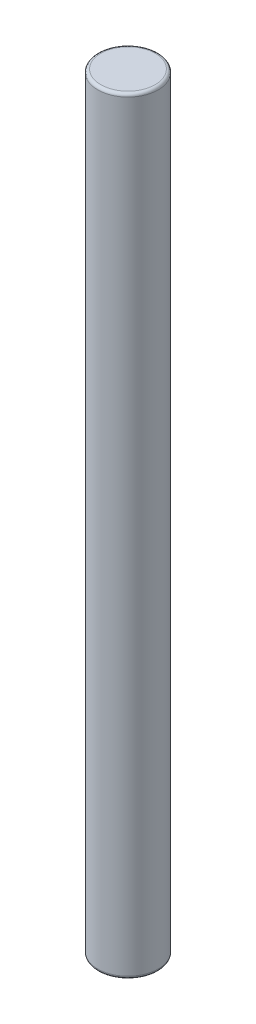
ISO-10303-21;
HEADER;
FILE_DESCRIPTION(('STEP AP214'),'2;1');
FILE_NAME('part.step','',(''),(''),'','','');
FILE_SCHEMA(('AUTOMOTIVE_DESIGN { 1 0 10303 214 1 1 1 1 }'));
ENDSEC;
DATA;
#1=APPLICATION_CONTEXT('core data for automotive mechanical design processes');
#2=APPLICATION_PROTOCOL_DEFINITION('international standard','automotive_design',2000,#1);
#3=PRODUCT_CONTEXT('',#1,'mechanical');
#4=PRODUCT('Part','Part','',(#3));
#5=PRODUCT_RELATED_PRODUCT_CATEGORY('part','',(#4));
#6=PRODUCT_DEFINITION_FORMATION('','',#4);
#7=PRODUCT_DEFINITION_CONTEXT('part definition',#1,'design');
#8=PRODUCT_DEFINITION('design','',#6,#7);
#9=PRODUCT_DEFINITION_SHAPE('','',#8);
#10=(LENGTH_UNIT() NAMED_UNIT(*) SI_UNIT(.MILLI.,.METRE.));
#11=(NAMED_UNIT(*) PLANE_ANGLE_UNIT() SI_UNIT($,.RADIAN.));
#12=(NAMED_UNIT(*) SI_UNIT($,.STERADIAN.) SOLID_ANGLE_UNIT());
#13=UNCERTAINTY_MEASURE_WITH_UNIT(LENGTH_MEASURE(1.E-05),#10,'distance_accuracy_value','');
#14=(GEOMETRIC_REPRESENTATION_CONTEXT(3) GLOBAL_UNCERTAINTY_ASSIGNED_CONTEXT((#13)) GLOBAL_UNIT_ASSIGNED_CONTEXT((#10,
#11,#12)) REPRESENTATION_CONTEXT('',''));
#15=CARTESIAN_POINT('',(0.,0.,0.));
#16=DIRECTION('',(0.,0.,1.));
#17=DIRECTION('',(1.,0.,0.));
#18=AXIS2_PLACEMENT_3D('',#15,#16,#17);
#19=CARTESIAN_POINT('',(0.,127.,0.));
#20=DIRECTION('',(0.,-1.,0.));
#21=DIRECTION('',(0.,0.,-1.));
#22=AXIS2_PLACEMENT_3D('',#19,#20,#21);
#23=CYLINDRICAL_SURFACE('',#22,5.);
#24=CARTESIAN_POINT('',(0.,0.5,0.));
#25=DIRECTION('',(0.,1.,0.));
#26=DIRECTION('',(0.,0.,1.));
#27=AXIS2_PLACEMENT_3D('',#24,#25,#26);
#28=CIRCLE('',#27,5.);
#29=CARTESIAN_POINT('',(0.,0.5,5.));
#30=VERTEX_POINT('',#29);
#31=EDGE_CURVE('E50',#30,#30,#28,.T.);
#32=ORIENTED_EDGE('',*,*,#31,.T.);
#33=EDGE_LOOP('',(#32));
#34=FACE_BOUND('',#33,.T.);
#35=CARTESIAN_POINT('',(0.,126.5,0.));
#36=DIRECTION('',(0.,1.,0.));
#37=DIRECTION('',(0.,0.,1.));
#38=AXIS2_PLACEMENT_3D('',#35,#36,#37);
#39=CIRCLE('',#38,5.);
#40=CARTESIAN_POINT('',(0.,126.5,5.));
#41=VERTEX_POINT('',#40);
#42=EDGE_CURVE('E55',#41,#41,#39,.F.);
#43=ORIENTED_EDGE('',*,*,#42,.T.);
#44=EDGE_LOOP('',(#43));
#45=FACE_BOUND('',#44,.T.);
#46=ADVANCED_FACE('F37',(#34,#45),#23,.T.);
#47=CARTESIAN_POINT('',(0.,127.,0.));
#48=DIRECTION('',(0.,1.,0.));
#49=DIRECTION('',(0.,0.,1.));
#50=AXIS2_PLACEMENT_3D('',#47,#48,#49);
#51=PLANE('',#50);
#52=CARTESIAN_POINT('',(0.,127.,0.));
#53=DIRECTION('',(0.,1.,0.));
#54=DIRECTION('',(0.,0.,1.));
#55=AXIS2_PLACEMENT_3D('',#52,#53,#54);
#56=CIRCLE('',#55,4.5);
#57=CARTESIAN_POINT('',(0.,127.,4.5));
#58=VERTEX_POINT('',#57);
#59=EDGE_CURVE('E10',#58,#58,#56,.T.);
#60=ORIENTED_EDGE('',*,*,#59,.T.);
#61=EDGE_LOOP('',(#60));
#62=FACE_BOUND('',#61,.T.);
#63=ADVANCED_FACE('F72',(#62),#51,.T.);
#64=CARTESIAN_POINT('',(0.,0.,0.));
#65=DIRECTION('',(0.,1.,0.));
#66=DIRECTION('',(0.,0.,1.));
#67=AXIS2_PLACEMENT_3D('',#64,#65,#66);
#68=PLANE('',#67);
#69=CARTESIAN_POINT('',(0.,0.,0.));
#70=DIRECTION('',(0.,1.,0.));
#71=DIRECTION('',(0.,0.,1.));
#72=AXIS2_PLACEMENT_3D('',#69,#70,#71);
#73=CIRCLE('',#72,4.5);
#74=CARTESIAN_POINT('',(0.,0.,4.5));
#75=VERTEX_POINT('',#74);
#76=EDGE_CURVE('E45',#75,#75,#73,.F.);
#77=ORIENTED_EDGE('',*,*,#76,.T.);
#78=EDGE_LOOP('',(#77));
#79=FACE_BOUND('',#78,.T.);
#80=ADVANCED_FACE('F69',(#79),#68,.F.);
#81=CARTESIAN_POINT('',(0.,0.5,0.));
#82=DIRECTION('',(0.,1.,0.));
#83=DIRECTION('',(0.,0.,1.));
#84=AXIS2_PLACEMENT_3D('',#81,#82,#83);
#85=TOROIDAL_SURFACE('',#84,4.5,0.5);
#86=ORIENTED_EDGE('',*,*,#76,.F.);
#87=EDGE_LOOP('',(#86));
#88=FACE_BOUND('',#87,.T.);
#89=ORIENTED_EDGE('',*,*,#31,.F.);
#90=EDGE_LOOP('',(#89));
#91=FACE_BOUND('',#90,.T.);
#92=ADVANCED_FACE('F65',(#88,#91),#85,.T.);
#93=CARTESIAN_POINT('',(0.,126.5,0.));
#94=DIRECTION('',(0.,1.,0.));
#95=DIRECTION('',(0.,0.,1.));
#96=AXIS2_PLACEMENT_3D('',#93,#94,#95);
#97=TOROIDAL_SURFACE('',#96,4.5,0.5);
#98=ORIENTED_EDGE('',*,*,#42,.F.);
#99=EDGE_LOOP('',(#98));
#100=FACE_BOUND('',#99,.T.);
#101=ORIENTED_EDGE('',*,*,#59,.F.);
#102=EDGE_LOOP('',(#101));
#103=FACE_BOUND('',#102,.T.);
#104=ADVANCED_FACE('F39',(#100,#103),#97,.T.);
#105=CLOSED_SHELL('',(#46,#63,#80,#92,#104));
#106=MANIFOLD_SOLID_BREP('B2',#105);
#107=ADVANCED_BREP_SHAPE_REPRESENTATION('',(#18,#106),#14);
#108=SHAPE_DEFINITION_REPRESENTATION(#9,#107);
ENDSEC;
END-ISO-10303-21;
